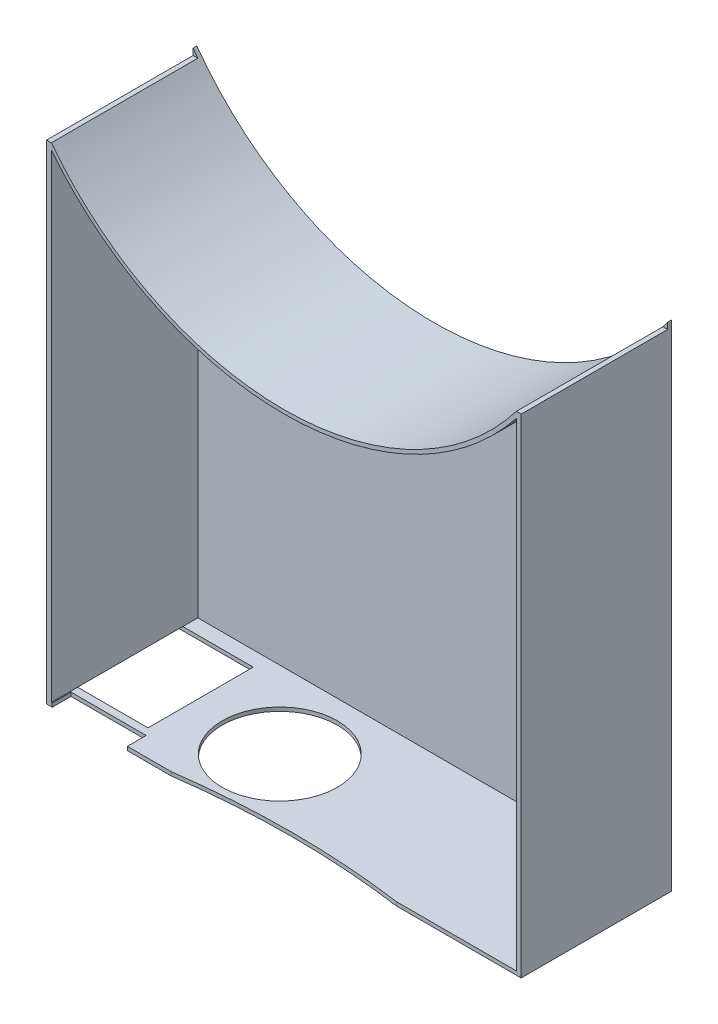
ISO-10303-21;
HEADER;
FILE_DESCRIPTION(('STEP AP214'),'2;1');
FILE_NAME('part.step','',(''),(''),'','','');
FILE_SCHEMA(('AUTOMOTIVE_DESIGN { 1 0 10303 214 1 1 1 1 }'));
ENDSEC;
DATA;
#1=APPLICATION_CONTEXT('core data for automotive mechanical design processes');
#2=APPLICATION_PROTOCOL_DEFINITION('international standard','automotive_design',2000,#1);
#3=PRODUCT_CONTEXT('',#1,'mechanical');
#4=PRODUCT('Part','Part','',(#3));
#5=PRODUCT_RELATED_PRODUCT_CATEGORY('part','',(#4));
#6=PRODUCT_DEFINITION_FORMATION('','',#4);
#7=PRODUCT_DEFINITION_CONTEXT('part definition',#1,'design');
#8=PRODUCT_DEFINITION('design','',#6,#7);
#9=PRODUCT_DEFINITION_SHAPE('','',#8);
#10=(LENGTH_UNIT() NAMED_UNIT(*) SI_UNIT(.MILLI.,.METRE.));
#11=(NAMED_UNIT(*) PLANE_ANGLE_UNIT() SI_UNIT($,.RADIAN.));
#12=(NAMED_UNIT(*) SI_UNIT($,.STERADIAN.) SOLID_ANGLE_UNIT());
#13=UNCERTAINTY_MEASURE_WITH_UNIT(LENGTH_MEASURE(1.E-05),#10,'distance_accuracy_value','');
#14=(GEOMETRIC_REPRESENTATION_CONTEXT(3) GLOBAL_UNCERTAINTY_ASSIGNED_CONTEXT((#13)) GLOBAL_UNIT_ASSIGNED_CONTEXT((#10,
#11,#12)) REPRESENTATION_CONTEXT('',''));
#15=CARTESIAN_POINT('',(0.,0.,0.));
#16=DIRECTION('',(0.,0.,1.));
#17=DIRECTION('',(1.,0.,0.));
#18=AXIS2_PLACEMENT_3D('',#15,#16,#17);
#19=CARTESIAN_POINT('',(0.,2.84494650060196E-13,0.));
#20=DIRECTION('',(0.,0.,1.));
#21=DIRECTION('',(1.,0.,0.));
#22=AXIS2_PLACEMENT_3D('',#19,#20,#21);
#23=PLANE('',#22);
#24=DIRECTION('',(1.,0.,0.));
#25=VECTOR('',#24,1.);
#26=CARTESIAN_POINT('',(-63.1581672483325,-177.455725785533,0.));
#27=LINE('',#26,#25);
#28=CARTESIAN_POINT('',(-63.1581672483325,-177.455725785533,0.));
#29=VERTEX_POINT('',#28);
#30=CARTESIAN_POINT('',(-61.6581672483325,-177.455725785533,0.));
#31=VERTEX_POINT('',#30);
#32=EDGE_CURVE('E365',#29,#31,#27,.T.);
#33=ORIENTED_EDGE('',*,*,#32,.T.);
#34=DIRECTION('',(0.,1.,0.));
#35=VECTOR('',#34,1.);
#36=CARTESIAN_POINT('',(-61.6581672483325,-177.455737785533,0.));
#37=LINE('',#36,#35);
#38=CARTESIAN_POINT('',(-61.6581672483325,-176.455725785533,0.));
#39=VERTEX_POINT('',#38);
#40=EDGE_CURVE('E241',#31,#39,#37,.T.);
#41=ORIENTED_EDGE('',*,*,#40,.T.);
#42=DIRECTION('',(-1.,0.,0.));
#43=VECTOR('',#42,1.);
#44=CARTESIAN_POINT('',(-63.1581672483325,-176.455725785533,0.));
#45=LINE('',#44,#43);
#46=CARTESIAN_POINT('',(-61.9027793412246,-176.455725785533,0.));
#47=VERTEX_POINT('',#46);
#48=EDGE_CURVE('E227',#39,#47,#45,.T.);
#49=ORIENTED_EDGE('',*,*,#48,.T.);
#50=DIRECTION('',(0.,1.,0.));
#51=VECTOR('',#50,1.);
#52=CARTESIAN_POINT('',(-61.9027793412246,-177.455725785533,0.));
#53=LINE('',#52,#51);
#54=CARTESIAN_POINT('',(-61.9027793412246,-49.0820324541645,0.));
#55=VERTEX_POINT('',#54);
#56=EDGE_CURVE('E380',#47,#55,#53,.T.);
#57=ORIENTED_EDGE('',*,*,#56,.T.);
#58=CARTESIAN_POINT('',(0.,1.11022302462516E-13,0.));
#59=DIRECTION('',(0.,0.,1.));
#60=DIRECTION('',(1.,0.,0.));
#61=AXIS2_PLACEMENT_3D('',#58,#59,#60);
#62=CIRCLE('',#61,79.0000000000001);
#63=CARTESIAN_POINT('',(61.9027793412246,-49.0820324541645,0.));
#64=VERTEX_POINT('',#63);
#65=EDGE_CURVE('E412',#55,#64,#62,.T.);
#66=ORIENTED_EDGE('',*,*,#65,.T.);
#67=DIRECTION('',(0.,1.,0.));
#68=VECTOR('',#67,1.);
#69=CARTESIAN_POINT('',(61.9027793412246,-177.455725785533,0.));
#70=LINE('',#69,#68);
#71=CARTESIAN_POINT('',(61.9027793412246,-176.455725785533,0.));
#72=VERTEX_POINT('',#71);
#73=EDGE_CURVE('E385',#72,#64,#70,.T.);
#74=ORIENTED_EDGE('',*,*,#73,.F.);
#75=CARTESIAN_POINT('',(30.,-176.455725785533,0.));
#76=VERTEX_POINT('',#75);
#77=EDGE_CURVE('E304',#72,#76,#45,.T.);
#78=ORIENTED_EDGE('',*,*,#77,.T.);
#79=DIRECTION('',(0.,-1.,0.));
#80=VECTOR('',#79,1.);
#81=CARTESIAN_POINT('',(30.,-138.455725785533,0.));
#82=LINE('',#81,#80);
#83=CARTESIAN_POINT('',(30.,-177.455725785533,0.));
#84=VERTEX_POINT('',#83);
#85=EDGE_CURVE('E297',#76,#84,#82,.T.);
#86=ORIENTED_EDGE('',*,*,#85,.T.);
#87=CARTESIAN_POINT('',(63.1581672483325,-177.455725785533,0.));
#88=VERTEX_POINT('',#87);
#89=EDGE_CURVE('E363',#84,#88,#27,.T.);
#90=ORIENTED_EDGE('',*,*,#89,.T.);
#91=DIRECTION('',(0.,1.,0.));
#92=VECTOR('',#91,1.);
#93=CARTESIAN_POINT('',(63.1581672483325,-177.455725785533,0.));
#94=LINE('',#93,#92);
#95=CARTESIAN_POINT('',(63.1581672483325,-47.4557257855326,0.));
#96=VERTEX_POINT('',#95);
#97=EDGE_CURVE('E389',#88,#96,#94,.T.);
#98=ORIENTED_EDGE('',*,*,#97,.T.);
#99=DIRECTION('',(-1.,0.,0.));
#100=VECTOR('',#99,1.);
#101=CARTESIAN_POINT('',(61.9027793412246,-47.4557257855326,0.));
#102=LINE('',#101,#100);
#103=CARTESIAN_POINT('',(61.9027793412246,-47.4557257855326,0.));
#104=VERTEX_POINT('',#103);
#105=EDGE_CURVE('E416',#96,#104,#102,.T.);
#106=ORIENTED_EDGE('',*,*,#105,.T.);
#107=CARTESIAN_POINT('',(0.,2.84494650060196E-13,0.));
#108=DIRECTION('',(0.,0.,-1.));
#109=DIRECTION('',(1.,0.,0.));
#110=AXIS2_PLACEMENT_3D('',#107,#108,#109);
#111=CIRCLE('',#110,78.0000000000002);
#112=CARTESIAN_POINT('',(-61.9027793412246,-47.4557257855326,0.));
#113=VERTEX_POINT('',#112);
#114=EDGE_CURVE('E404',#104,#113,#111,.T.);
#115=ORIENTED_EDGE('',*,*,#114,.T.);
#116=DIRECTION('',(-1.,0.,0.));
#117=VECTOR('',#116,1.);
#118=CARTESIAN_POINT('',(-63.1581672483325,-47.4557257855326,0.));
#119=LINE('',#118,#117);
#120=CARTESIAN_POINT('',(-63.1581672483325,-47.4557257855326,0.));
#121=VERTEX_POINT('',#120);
#122=EDGE_CURVE('E408',#113,#121,#119,.T.);
#123=ORIENTED_EDGE('',*,*,#122,.T.);
#124=DIRECTION('',(0.,1.,0.));
#125=VECTOR('',#124,1.);
#126=CARTESIAN_POINT('',(-63.1581672483325,-177.455725785533,0.));
#127=LINE('',#126,#125);
#128=EDGE_CURVE('E374',#29,#121,#127,.T.);
#129=ORIENTED_EDGE('',*,*,#128,.F.);
#130=EDGE_LOOP('',(#33,#41,#49,#57,#66,#74,#78,#86,#90,#98,#106,#115,#123,#129));
#131=FACE_BOUND('',#130,.T.);
#132=ADVANCED_FACE('F47',(#131),#23,.T.);
#133=CARTESIAN_POINT('',(-30.,-176.455725785533,0.));
#134=VERTEX_POINT('',#133);
#135=CARTESIAN_POINT('',(-41.6581672483325,-176.455725785533,0.));
#136=VERTEX_POINT('',#135);
#137=EDGE_CURVE('E309',#134,#136,#45,.T.);
#138=ORIENTED_EDGE('',*,*,#137,.T.);
#139=DIRECTION('',(0.,1.,0.));
#140=VECTOR('',#139,1.);
#141=CARTESIAN_POINT('',(-41.6581672483325,-177.455737785533,0.));
#142=LINE('',#141,#140);
#143=CARTESIAN_POINT('',(-41.6581672483325,-177.455725785533,0.));
#144=VERTEX_POINT('',#143);
#145=EDGE_CURVE('E244',#144,#136,#142,.T.);
#146=ORIENTED_EDGE('',*,*,#145,.F.);
#147=CARTESIAN_POINT('',(-30.,-177.455725785533,0.));
#148=VERTEX_POINT('',#147);
#149=EDGE_CURVE('E370',#144,#148,#27,.T.);
#150=ORIENTED_EDGE('',*,*,#149,.T.);
#151=DIRECTION('',(0.,-1.,0.));
#152=VECTOR('',#151,1.);
#153=CARTESIAN_POINT('',(-30.,-138.455725785533,0.));
#154=LINE('',#153,#152);
#155=EDGE_CURVE('E296',#134,#148,#154,.T.);
#156=ORIENTED_EDGE('',*,*,#155,.F.);
#157=EDGE_LOOP('',(#138,#146,#150,#156));
#158=FACE_BOUND('',#157,.T.);
#159=ADVANCED_FACE('F486',(#158),#23,.T.);
#160=CARTESIAN_POINT('',(-63.1581672483325,-177.455725785533,0.));
#161=DIRECTION('',(-1.,0.,0.));
#162=DIRECTION('',(0.,0.,1.));
#163=AXIS2_PLACEMENT_3D('',#160,#161,#162);
#164=PLANE('',#163);
#165=DIRECTION('',(0.,0.,1.));
#166=VECTOR('',#165,1.);
#167=CARTESIAN_POINT('',(-63.1581672483325,-177.455725785533,0.));
#168=LINE('',#167,#166);
#169=CARTESIAN_POINT('',(-63.1581672483325,-177.455725785533,-40.));
#170=VERTEX_POINT('',#169);
#171=CARTESIAN_POINT('',(-63.1581672483325,-177.455725785533,-35.));
#172=VERTEX_POINT('',#171);
#173=EDGE_CURVE('E359',#170,#172,#168,.T.);
#174=ORIENTED_EDGE('',*,*,#173,.T.);
#175=DIRECTION('',(0.,1.,0.));
#176=VECTOR('',#175,1.);
#177=CARTESIAN_POINT('',(-63.1581672483325,-177.455737785533,-35.));
#178=LINE('',#177,#176);
#179=CARTESIAN_POINT('',(-63.1581672483325,-176.455725785533,-35.));
#180=VERTEX_POINT('',#179);
#181=EDGE_CURVE('E249',#172,#180,#178,.T.);
#182=ORIENTED_EDGE('',*,*,#181,.T.);
#183=DIRECTION('',(0.,0.,-1.));
#184=VECTOR('',#183,1.);
#185=CARTESIAN_POINT('',(-63.1581672483325,-176.455725785533,-7.));
#186=LINE('',#185,#184);
#187=CARTESIAN_POINT('',(-63.1581672483325,-176.455725785533,-7.));
#188=VERTEX_POINT('',#187);
#189=EDGE_CURVE('E229',#188,#180,#186,.T.);
#190=ORIENTED_EDGE('',*,*,#189,.F.);
#191=DIRECTION('',(0.,1.,0.));
#192=VECTOR('',#191,1.);
#193=CARTESIAN_POINT('',(-63.1581672483325,-177.455737785533,-7.));
#194=LINE('',#193,#192);
#195=CARTESIAN_POINT('',(-63.1581672483325,-177.455725785533,-7.));
#196=VERTEX_POINT('',#195);
#197=EDGE_CURVE('E259',#196,#188,#194,.T.);
#198=ORIENTED_EDGE('',*,*,#197,.F.);
#199=EDGE_CURVE('E364',#196,#29,#168,.T.);
#200=ORIENTED_EDGE('',*,*,#199,.T.);
#201=ORIENTED_EDGE('',*,*,#128,.T.);
#202=DIRECTION('',(0.,0.,1.));
#203=VECTOR('',#202,1.);
#204=CARTESIAN_POINT('',(-63.1581672483325,-47.4557257855326,-40.));
#205=LINE('',#204,#203);
#206=CARTESIAN_POINT('',(-63.1581672483325,-47.4557257855326,-39.));
#207=VERTEX_POINT('',#206);
#208=EDGE_CURVE('E429',#207,#121,#205,.T.);
#209=ORIENTED_EDGE('',*,*,#208,.F.);
#210=DIRECTION('',(0.,-1.,0.));
#211=VECTOR('',#210,1.);
#212=CARTESIAN_POINT('',(-63.1581672483325,-27.4557257855326,-39.));
#213=LINE('',#212,#211);
#214=CARTESIAN_POINT('',(-63.1581672483325,-45.7716714773632,-39.));
#215=VERTEX_POINT('',#214);
#216=EDGE_CURVE('E334',#215,#207,#213,.T.);
#217=ORIENTED_EDGE('',*,*,#216,.F.);
#218=DIRECTION('',(0.,0.,1.));
#219=VECTOR('',#218,1.);
#220=CARTESIAN_POINT('',(-63.1581672483325,-45.7716714773632,-129.));
#221=LINE('',#220,#219);
#222=CARTESIAN_POINT('',(-63.1581672483325,-45.7716714773632,-40.));
#223=VERTEX_POINT('',#222);
#224=EDGE_CURVE('E330',#223,#215,#221,.T.);
#225=ORIENTED_EDGE('',*,*,#224,.F.);
#226=DIRECTION('',(0.,1.,0.));
#227=VECTOR('',#226,1.);
#228=CARTESIAN_POINT('',(-63.1581672483325,-177.455725785533,-40.));
#229=LINE('',#228,#227);
#230=EDGE_CURVE('E375',#170,#223,#229,.T.);
#231=ORIENTED_EDGE('',*,*,#230,.F.);
#232=EDGE_LOOP('',(#174,#182,#190,#198,#200,#201,#209,#217,#225,#231));
#233=FACE_BOUND('',#232,.T.);
#234=ADVANCED_FACE('F492',(#233),#164,.T.);
#235=CARTESIAN_POINT('',(0.,-177.455725785533,0.));
#236=DIRECTION('',(0.,-1.,0.));
#237=DIRECTION('',(0.,0.,-1.));
#238=AXIS2_PLACEMENT_3D('',#235,#236,#237);
#239=PLANE('',#238);
#240=CARTESIAN_POINT('',(-19.5876766170702,-177.455725785533,-18.4993312269172));
#241=DIRECTION('',(0.,-1.,0.));
#242=DIRECTION('',(0.,0.,-1.));
#243=AXIS2_PLACEMENT_3D('',#240,#241,#242);
#244=CIRCLE('',#243,15.3356405172815);
#245=CARTESIAN_POINT('',(-19.5876766170702,-177.455725785533,-33.8349717441988));
#246=VERTEX_POINT('',#245);
#247=EDGE_CURVE('E236',#246,#246,#244,.T.);
#248=ORIENTED_EDGE('',*,*,#247,.F.);
#249=EDGE_LOOP('',(#248));
#250=FACE_BOUND('',#249,.T.);
#251=DIRECTION('',(-1.,0.,0.));
#252=VECTOR('',#251,1.);
#253=CARTESIAN_POINT('',(0.,-177.455725785533,-5.));
#254=LINE('',#253,#252);
#255=CARTESIAN_POINT('',(-41.6581672483325,-177.455725785533,-5.));
#256=VERTEX_POINT('',#255);
#257=CARTESIAN_POINT('',(-61.6581672483325,-177.455725785533,-5.));
#258=VERTEX_POINT('',#257);
#259=EDGE_CURVE('E288',#256,#258,#254,.T.);
#260=ORIENTED_EDGE('',*,*,#259,.T.);
#261=DIRECTION('',(0.,0.,1.));
#262=VECTOR('',#261,1.);
#263=CARTESIAN_POINT('',(-61.6581672483325,-177.455725785533,1.71135792338219E-13));
#264=LINE('',#263,#262);
#265=EDGE_CURVE('E207',#258,#31,#264,.T.);
#266=ORIENTED_EDGE('',*,*,#265,.T.);
#267=ORIENTED_EDGE('',*,*,#32,.F.);
#268=ORIENTED_EDGE('',*,*,#199,.F.);
#269=DIRECTION('',(1.,0.,0.));
#270=VECTOR('',#269,1.);
#271=CARTESIAN_POINT('',(0.,-177.455725785533,-7.));
#272=LINE('',#271,#270);
#273=CARTESIAN_POINT('',(-43.1581672483325,-177.455725785533,-7.));
#274=VERTEX_POINT('',#273);
#275=EDGE_CURVE('E211',#196,#274,#272,.T.);
#276=ORIENTED_EDGE('',*,*,#275,.T.);
#277=DIRECTION('',(0.,0.,-1.));
#278=VECTOR('',#277,1.);
#279=CARTESIAN_POINT('',(-43.1581672483325,-177.455725785533,0.));
#280=LINE('',#279,#278);
#281=CARTESIAN_POINT('',(-43.1581672483325,-177.455725785533,-35.));
#282=VERTEX_POINT('',#281);
#283=EDGE_CURVE('E276',#274,#282,#280,.T.);
#284=ORIENTED_EDGE('',*,*,#283,.T.);
#285=DIRECTION('',(-1.,0.,0.));
#286=VECTOR('',#285,1.);
#287=CARTESIAN_POINT('',(0.,-177.455725785533,-35.));
#288=LINE('',#287,#286);
#289=EDGE_CURVE('E280',#282,#172,#288,.T.);
#290=ORIENTED_EDGE('',*,*,#289,.T.);
#291=ORIENTED_EDGE('',*,*,#173,.F.);
#292=DIRECTION('',(-1.,0.,0.));
#293=VECTOR('',#292,1.);
#294=CARTESIAN_POINT('',(-63.1581672483325,-177.455725785533,-40.));
#295=LINE('',#294,#293);
#296=CARTESIAN_POINT('',(63.1581672483325,-177.455725785533,-40.));
#297=VERTEX_POINT('',#296);
#298=EDGE_CURVE('E369',#297,#170,#295,.T.);
#299=ORIENTED_EDGE('',*,*,#298,.F.);
#300=DIRECTION('',(0.,0.,-1.));
#301=VECTOR('',#300,1.);
#302=CARTESIAN_POINT('',(63.1581672483325,-177.455725785533,-40.));
#303=LINE('',#302,#301);
#304=EDGE_CURVE('E388',#88,#297,#303,.T.);
#305=ORIENTED_EDGE('',*,*,#304,.F.);
#306=ORIENTED_EDGE('',*,*,#89,.F.);
#307=CARTESIAN_POINT('',(0.,-177.455725785533,215.767352745814));
#308=DIRECTION('',(0.,-1.,0.));
#309=DIRECTION('',(0.,0.,-1.));
#310=AXIS2_PLACEMENT_3D('',#307,#308,#309);
#311=CIRCLE('',#310,217.842949188025);
#312=EDGE_CURVE('E293',#148,#84,#311,.T.);
#313=ORIENTED_EDGE('',*,*,#312,.F.);
#314=ORIENTED_EDGE('',*,*,#149,.F.);
#315=DIRECTION('',(0.,0.,-1.));
#316=VECTOR('',#315,1.);
#317=CARTESIAN_POINT('',(-41.6581672483325,-177.455725785533,0.));
#318=LINE('',#317,#316);
#319=EDGE_CURVE('E284',#144,#256,#318,.T.);
#320=ORIENTED_EDGE('',*,*,#319,.T.);
#321=EDGE_LOOP('',(#260,#266,#267,#268,#276,#284,#290,#291,#299,#305,#306,#313,#314,#320));
#322=FACE_BOUND('',#321,.T.);
#323=ADVANCED_FACE('F524',(#250,#322),#239,.T.);
#324=CARTESIAN_POINT('',(-63.1581672483325,-176.455725785533,0.));
#325=DIRECTION('',(0.,-1.,0.));
#326=DIRECTION('',(0.,0.,-1.));
#327=AXIS2_PLACEMENT_3D('',#324,#325,#326);
#328=PLANE('',#327);
#329=CARTESIAN_POINT('',(-19.5876766170702,-176.455725785533,-18.4993312269172));
#330=DIRECTION('',(0.,-1.,0.));
#331=DIRECTION('',(0.,0.,-1.));
#332=AXIS2_PLACEMENT_3D('',#329,#330,#331);
#333=CIRCLE('',#332,15.3356405172815);
#334=CARTESIAN_POINT('',(-19.5876766170702,-176.455725785533,-33.8349717441988));
#335=VERTEX_POINT('',#334);
#336=EDGE_CURVE('E254',#335,#335,#333,.T.);
#337=ORIENTED_EDGE('',*,*,#336,.T.);
#338=EDGE_LOOP('',(#337));
#339=FACE_BOUND('',#338,.T.);
#340=DIRECTION('',(0.,0.,-1.));
#341=VECTOR('',#340,1.);
#342=CARTESIAN_POINT('',(-61.6581672483325,-176.455725785533,0.));
#343=LINE('',#342,#341);
#344=CARTESIAN_POINT('',(-61.6581672483325,-176.455725785533,-5.));
#345=VERTEX_POINT('',#344);
#346=EDGE_CURVE('E204',#39,#345,#343,.T.);
#347=ORIENTED_EDGE('',*,*,#346,.T.);
#348=DIRECTION('',(1.,0.,0.));
#349=VECTOR('',#348,1.);
#350=CARTESIAN_POINT('',(-61.6581672483325,-176.455725785533,-5.));
#351=LINE('',#350,#349);
#352=CARTESIAN_POINT('',(-41.6581672483325,-176.455725785533,-5.));
#353=VERTEX_POINT('',#352);
#354=EDGE_CURVE('E215',#345,#353,#351,.T.);
#355=ORIENTED_EDGE('',*,*,#354,.T.);
#356=DIRECTION('',(0.,0.,1.));
#357=VECTOR('',#356,1.);
#358=CARTESIAN_POINT('',(-41.6581672483325,-176.455725785533,0.));
#359=LINE('',#358,#357);
#360=EDGE_CURVE('E222',#353,#136,#359,.T.);
#361=ORIENTED_EDGE('',*,*,#360,.T.);
#362=ORIENTED_EDGE('',*,*,#137,.F.);
#363=CARTESIAN_POINT('',(0.,-176.455725785533,215.767352745814));
#364=DIRECTION('',(0.,-1.,0.));
#365=DIRECTION('',(0.,0.,-1.));
#366=AXIS2_PLACEMENT_3D('',#363,#364,#365);
#367=CIRCLE('',#366,217.842949188025);
#368=EDGE_CURVE('E56',#134,#76,#367,.T.);
#369=ORIENTED_EDGE('',*,*,#368,.T.);
#370=ORIENTED_EDGE('',*,*,#77,.F.);
#371=DIRECTION('',(0.,0.,1.));
#372=VECTOR('',#371,1.);
#373=CARTESIAN_POINT('',(61.9027793412246,-176.455725785533,-40.));
#374=LINE('',#373,#372);
#375=CARTESIAN_POINT('',(61.9027793412246,-176.455725785533,-39.));
#376=VERTEX_POINT('',#375);
#377=EDGE_CURVE('E308',#376,#72,#374,.T.);
#378=ORIENTED_EDGE('',*,*,#377,.F.);
#379=DIRECTION('',(1.,0.,0.));
#380=VECTOR('',#379,1.);
#381=CARTESIAN_POINT('',(-63.1581672483325,-176.455725785533,-39.));
#382=LINE('',#381,#380);
#383=CARTESIAN_POINT('',(-61.9027793412246,-176.455725785533,-39.));
#384=VERTEX_POINT('',#383);
#385=EDGE_CURVE('E424',#384,#376,#382,.T.);
#386=ORIENTED_EDGE('',*,*,#385,.F.);
#387=DIRECTION('',(0.,0.,-1.));
#388=VECTOR('',#387,1.);
#389=CARTESIAN_POINT('',(-61.9027793412246,-176.455725785533,0.));
#390=LINE('',#389,#388);
#391=CARTESIAN_POINT('',(-61.9027793412246,-176.455725785533,-35.));
#392=VERTEX_POINT('',#391);
#393=EDGE_CURVE('E313',#392,#384,#390,.T.);
#394=ORIENTED_EDGE('',*,*,#393,.F.);
#395=DIRECTION('',(-1.,0.,0.));
#396=VECTOR('',#395,1.);
#397=CARTESIAN_POINT('',(-63.1581672483325,-176.455725785533,-35.));
#398=LINE('',#397,#396);
#399=CARTESIAN_POINT('',(-43.1581672483325,-176.455725785533,-35.));
#400=VERTEX_POINT('',#399);
#401=EDGE_CURVE('E11',#400,#392,#398,.T.);
#402=ORIENTED_EDGE('',*,*,#401,.F.);
#403=DIRECTION('',(0.,0.,1.));
#404=VECTOR('',#403,1.);
#405=CARTESIAN_POINT('',(-43.1581672483325,-176.455725785533,-7.));
#406=LINE('',#405,#404);
#407=CARTESIAN_POINT('',(-43.1581672483325,-176.455725785533,-7.));
#408=VERTEX_POINT('',#407);
#409=EDGE_CURVE('E266',#400,#408,#406,.T.);
#410=ORIENTED_EDGE('',*,*,#409,.T.);
#411=DIRECTION('',(-1.,0.,0.));
#412=VECTOR('',#411,1.);
#413=CARTESIAN_POINT('',(-63.1581672483325,-176.455725785533,-7.));
#414=LINE('',#413,#412);
#415=CARTESIAN_POINT('',(-61.9027793412246,-176.455725785533,-7.));
#416=VERTEX_POINT('',#415);
#417=EDGE_CURVE('E262',#408,#416,#414,.T.);
#418=ORIENTED_EDGE('',*,*,#417,.T.);
#419=EDGE_CURVE('E314',#47,#416,#390,.T.);
#420=ORIENTED_EDGE('',*,*,#419,.F.);
#421=ORIENTED_EDGE('',*,*,#48,.F.);
#422=EDGE_LOOP('',(#347,#355,#361,#362,#369,#370,#378,#386,#394,#402,#410,#418,#420,#421));
#423=FACE_BOUND('',#422,.T.);
#424=ADVANCED_FACE('F225',(#339,#423),#328,.F.);
#425=CARTESIAN_POINT('',(-61.9027793412246,-177.455725785533,0.));
#426=DIRECTION('',(1.,0.,0.));
#427=DIRECTION('',(0.,0.,-1.));
#428=AXIS2_PLACEMENT_3D('',#425,#426,#427);
#429=PLANE('',#428);
#430=ORIENTED_EDGE('',*,*,#56,.F.);
#431=ORIENTED_EDGE('',*,*,#419,.T.);
#432=EDGE_CURVE('E319',#416,#392,#390,.T.);
#433=ORIENTED_EDGE('',*,*,#432,.T.);
#434=ORIENTED_EDGE('',*,*,#393,.T.);
#435=DIRECTION('',(0.,-1.,0.));
#436=VECTOR('',#435,1.);
#437=CARTESIAN_POINT('',(-61.9027793412246,-177.455725785533,-39.));
#438=LINE('',#437,#436);
#439=CARTESIAN_POINT('',(-61.9027793412246,-49.0820324541645,-39.));
#440=VERTEX_POINT('',#439);
#441=EDGE_CURVE('E346',#440,#384,#438,.T.);
#442=ORIENTED_EDGE('',*,*,#441,.F.);
#443=DIRECTION('',(0.,0.,1.));
#444=VECTOR('',#443,1.);
#445=CARTESIAN_POINT('',(-61.9027793412246,-49.0820324541645,-40.));
#446=LINE('',#445,#444);
#447=EDGE_CURVE('E400',#440,#55,#446,.T.);
#448=ORIENTED_EDGE('',*,*,#447,.T.);
#449=EDGE_LOOP('',(#430,#431,#433,#434,#442,#448));
#450=FACE_BOUND('',#449,.T.);
#451=ADVANCED_FACE('F464',(#450),#429,.T.);
#452=CARTESIAN_POINT('',(61.9027793412246,-177.455725785533,-40.));
#453=DIRECTION('',(-1.,0.,0.));
#454=DIRECTION('',(0.,0.,1.));
#455=AXIS2_PLACEMENT_3D('',#452,#453,#454);
#456=PLANE('',#455);
#457=DIRECTION('',(0.,1.,0.));
#458=VECTOR('',#457,1.);
#459=CARTESIAN_POINT('',(61.9027793412246,-177.455725785533,-39.));
#460=LINE('',#459,#458);
#461=CARTESIAN_POINT('',(61.9027793412246,-49.0820324541645,-39.));
#462=VERTEX_POINT('',#461);
#463=EDGE_CURVE('E337',#376,#462,#460,.T.);
#464=ORIENTED_EDGE('',*,*,#463,.F.);
#465=ORIENTED_EDGE('',*,*,#377,.T.);
#466=ORIENTED_EDGE('',*,*,#73,.T.);
#467=DIRECTION('',(0.,0.,1.));
#468=VECTOR('',#467,1.);
#469=CARTESIAN_POINT('',(61.9027793412246,-49.0820324541645,-40.));
#470=LINE('',#469,#468);
#471=EDGE_CURVE('E379',#64,#462,#470,.F.);
#472=ORIENTED_EDGE('',*,*,#471,.T.);
#473=EDGE_LOOP('',(#464,#465,#466,#472));
#474=FACE_BOUND('',#473,.T.);
#475=ADVANCED_FACE('F450',(#474),#456,.T.);
#476=CARTESIAN_POINT('',(-63.1581672483325,-27.4557257855326,-39.));
#477=DIRECTION('',(0.,0.,1.));
#478=DIRECTION('',(1.,0.,0.));
#479=AXIS2_PLACEMENT_3D('',#476,#477,#478);
#480=PLANE('',#479);
#481=ORIENTED_EDGE('',*,*,#441,.T.);
#482=ORIENTED_EDGE('',*,*,#385,.T.);
#483=ORIENTED_EDGE('',*,*,#463,.T.);
#484=CARTESIAN_POINT('',(0.,1.11022302462516E-13,-39.));
#485=DIRECTION('',(0.,0.,1.));
#486=DIRECTION('',(1.,0.,0.));
#487=AXIS2_PLACEMENT_3D('',#484,#485,#486);
#488=CIRCLE('',#487,79.0000000000001);
#489=EDGE_CURVE('E342',#462,#440,#488,.F.);
#490=ORIENTED_EDGE('',*,*,#489,.T.);
#491=EDGE_LOOP('',(#481,#482,#483,#490));
#492=FACE_BOUND('',#491,.T.);
#493=ADVANCED_FACE('F456',(#492),#480,.T.);
#494=CARTESIAN_POINT('',(0.,0.,-39.));
#495=DIRECTION('',(0.,0.,1.));
#496=DIRECTION('',(1.,0.,0.));
#497=AXIS2_PLACEMENT_3D('',#494,#495,#496);
#498=CIRCLE('',#497,78.);
#499=CARTESIAN_POINT('',(-61.9027793412246,-47.4557257855326,-39.));
#500=VERTEX_POINT('',#499);
#501=EDGE_CURVE('E320',#215,#500,#498,.T.);
#502=ORIENTED_EDGE('',*,*,#501,.F.);
#503=ORIENTED_EDGE('',*,*,#216,.T.);
#504=DIRECTION('',(1.,0.,0.));
#505=VECTOR('',#504,1.);
#506=CARTESIAN_POINT('',(-63.1581672483325,-47.4557257855326,-39.));
#507=LINE('',#506,#505);
#508=EDGE_CURVE('E350',#207,#500,#507,.T.);
#509=ORIENTED_EDGE('',*,*,#508,.T.);
#510=EDGE_LOOP('',(#502,#503,#509));
#511=FACE_BOUND('',#510,.T.);
#512=ADVANCED_FACE('F549',(#511),#480,.T.);
#513=CARTESIAN_POINT('',(0.,2.84494650060196E-13,-40.));
#514=DIRECTION('',(0.,0.,1.));
#515=DIRECTION('',(1.,0.,0.));
#516=AXIS2_PLACEMENT_3D('',#513,#514,#515);
#517=CYLINDRICAL_SURFACE('',#516,78.0000000000002);
#518=DIRECTION('',(0.,0.,1.));
#519=VECTOR('',#518,1.);
#520=CARTESIAN_POINT('',(61.9027793412246,-47.4557257855326,-40.));
#521=LINE('',#520,#519);
#522=CARTESIAN_POINT('',(61.9027793412246,-47.4557257855326,-39.));
#523=VERTEX_POINT('',#522);
#524=EDGE_CURVE('E421',#523,#104,#521,.T.);
#525=ORIENTED_EDGE('',*,*,#524,.F.);
#526=CARTESIAN_POINT('',(63.1581672483325,-45.7716714773632,-39.));
#527=VERTEX_POINT('',#526);
#528=EDGE_CURVE('E318',#523,#527,#498,.T.);
#529=ORIENTED_EDGE('',*,*,#528,.T.);
#530=DIRECTION('',(0.,0.,1.));
#531=VECTOR('',#530,1.);
#532=CARTESIAN_POINT('',(63.1581672483325,-45.7716714773632,-129.));
#533=LINE('',#532,#531);
#534=CARTESIAN_POINT('',(63.1581672483325,-45.7716714773632,-40.));
#535=VERTEX_POINT('',#534);
#536=EDGE_CURVE('E323',#527,#535,#533,.F.);
#537=ORIENTED_EDGE('',*,*,#536,.T.);
#538=CARTESIAN_POINT('',(0.,0.,-40.));
#539=DIRECTION('',(0.,0.,1.));
#540=DIRECTION('',(1.,0.,0.));
#541=AXIS2_PLACEMENT_3D('',#538,#539,#540);
#542=CIRCLE('',#541,78.);
#543=EDGE_CURVE('E326',#223,#535,#542,.T.);
#544=ORIENTED_EDGE('',*,*,#543,.F.);
#545=ORIENTED_EDGE('',*,*,#224,.T.);
#546=ORIENTED_EDGE('',*,*,#501,.T.);
#547=DIRECTION('',(0.,0.,1.));
#548=VECTOR('',#547,1.);
#549=CARTESIAN_POINT('',(-61.9027793412246,-47.4557257855326,-40.));
#550=LINE('',#549,#548);
#551=EDGE_CURVE('E420',#500,#113,#550,.T.);
#552=ORIENTED_EDGE('',*,*,#551,.T.);
#553=ORIENTED_EDGE('',*,*,#114,.F.);
#554=EDGE_LOOP('',(#525,#529,#537,#544,#545,#546,#552,#553));
#555=FACE_BOUND('',#554,.T.);
#556=ADVANCED_FACE('F49',(#555),#517,.F.);
#557=CARTESIAN_POINT('',(61.9027793412246,-47.4557257855326,-40.));
#558=DIRECTION('',(0.,1.,0.));
#559=DIRECTION('',(0.,0.,1.));
#560=AXIS2_PLACEMENT_3D('',#557,#558,#559);
#561=PLANE('',#560);
#562=DIRECTION('',(1.,0.,0.));
#563=VECTOR('',#562,1.);
#564=CARTESIAN_POINT('',(61.9027793412246,-47.4557257855326,-39.));
#565=LINE('',#564,#563);
#566=CARTESIAN_POINT('',(63.1581672483325,-47.4557257855326,-39.));
#567=VERTEX_POINT('',#566);
#568=EDGE_CURVE('E354',#523,#567,#565,.T.);
#569=ORIENTED_EDGE('',*,*,#568,.F.);
#570=ORIENTED_EDGE('',*,*,#524,.T.);
#571=ORIENTED_EDGE('',*,*,#105,.F.);
#572=DIRECTION('',(0.,0.,1.));
#573=VECTOR('',#572,1.);
#574=CARTESIAN_POINT('',(63.1581672483325,-47.4557257855326,-40.));
#575=LINE('',#574,#573);
#576=EDGE_CURVE('E425',#567,#96,#575,.T.);
#577=ORIENTED_EDGE('',*,*,#576,.F.);
#578=EDGE_LOOP('',(#569,#570,#571,#577));
#579=FACE_BOUND('',#578,.T.);
#580=ADVANCED_FACE('F498',(#579),#561,.T.);
#581=CARTESIAN_POINT('',(0.,1.11022302462516E-13,-40.));
#582=DIRECTION('',(0.,0.,1.));
#583=DIRECTION('',(1.,0.,0.));
#584=AXIS2_PLACEMENT_3D('',#581,#582,#583);
#585=CYLINDRICAL_SURFACE('',#584,79.0000000000001);
#586=ORIENTED_EDGE('',*,*,#489,.F.);
#587=ORIENTED_EDGE('',*,*,#471,.F.);
#588=ORIENTED_EDGE('',*,*,#65,.F.);
#589=ORIENTED_EDGE('',*,*,#447,.F.);
#590=EDGE_LOOP('',(#586,#587,#588,#589));
#591=FACE_BOUND('',#590,.T.);
#592=ADVANCED_FACE('F453',(#591),#585,.T.);
#593=CARTESIAN_POINT('',(-63.1581672483325,-47.4557257855326,-40.));
#594=DIRECTION('',(0.,1.,0.));
#595=DIRECTION('',(0.,0.,1.));
#596=AXIS2_PLACEMENT_3D('',#593,#594,#595);
#597=PLANE('',#596);
#598=ORIENTED_EDGE('',*,*,#508,.F.);
#599=ORIENTED_EDGE('',*,*,#208,.T.);
#600=ORIENTED_EDGE('',*,*,#122,.F.);
#601=ORIENTED_EDGE('',*,*,#551,.F.);
#602=EDGE_LOOP('',(#598,#599,#600,#601));
#603=FACE_BOUND('',#602,.T.);
#604=ADVANCED_FACE('F503',(#603),#597,.T.);
#605=CARTESIAN_POINT('',(0.,2.84494650060196E-13,-40.));
#606=DIRECTION('',(0.,0.,1.));
#607=DIRECTION('',(1.,0.,0.));
#608=AXIS2_PLACEMENT_3D('',#605,#606,#607);
#609=PLANE('',#608);
#610=ORIENTED_EDGE('',*,*,#230,.T.);
#611=ORIENTED_EDGE('',*,*,#543,.T.);
#612=DIRECTION('',(0.,1.,0.));
#613=VECTOR('',#612,1.);
#614=CARTESIAN_POINT('',(63.1581672483325,-177.455725785533,-40.));
#615=LINE('',#614,#613);
#616=EDGE_CURVE('E358',#297,#535,#615,.T.);
#617=ORIENTED_EDGE('',*,*,#616,.F.);
#618=ORIENTED_EDGE('',*,*,#298,.T.);
#619=EDGE_LOOP('',(#610,#611,#617,#618));
#620=FACE_BOUND('',#619,.T.);
#621=ADVANCED_FACE('F496',(#620),#609,.F.);
#622=CARTESIAN_POINT('',(63.1581672483325,-177.455725785533,-40.));
#623=DIRECTION('',(1.,0.,0.));
#624=DIRECTION('',(0.,0.,-1.));
#625=AXIS2_PLACEMENT_3D('',#622,#623,#624);
#626=PLANE('',#625);
#627=ORIENTED_EDGE('',*,*,#576,.T.);
#628=ORIENTED_EDGE('',*,*,#97,.F.);
#629=ORIENTED_EDGE('',*,*,#304,.T.);
#630=ORIENTED_EDGE('',*,*,#616,.T.);
#631=ORIENTED_EDGE('',*,*,#536,.F.);
#632=DIRECTION('',(0.,-1.,0.));
#633=VECTOR('',#632,1.);
#634=CARTESIAN_POINT('',(63.1581672483325,-27.4557257855326,-39.));
#635=LINE('',#634,#633);
#636=EDGE_CURVE('E333',#527,#567,#635,.T.);
#637=ORIENTED_EDGE('',*,*,#636,.T.);
#638=EDGE_LOOP('',(#627,#628,#629,#630,#631,#637));
#639=FACE_BOUND('',#638,.T.);
#640=ADVANCED_FACE('F509',(#639),#626,.T.);
#641=ORIENTED_EDGE('',*,*,#528,.F.);
#642=ORIENTED_EDGE('',*,*,#568,.T.);
#643=ORIENTED_EDGE('',*,*,#636,.F.);
#644=EDGE_LOOP('',(#641,#642,#643));
#645=FACE_BOUND('',#644,.T.);
#646=ADVANCED_FACE('F547',(#645),#480,.T.);
#647=CARTESIAN_POINT('',(0.,-138.455725785533,215.767352745814));
#648=DIRECTION('',(0.,-1.,0.));
#649=DIRECTION('',(0.,0.,-1.));
#650=AXIS2_PLACEMENT_3D('',#647,#648,#649);
#651=CYLINDRICAL_SURFACE('',#650,217.842949188025);
#652=ORIENTED_EDGE('',*,*,#155,.T.);
#653=ORIENTED_EDGE('',*,*,#312,.T.);
#654=ORIENTED_EDGE('',*,*,#85,.F.);
#655=ORIENTED_EDGE('',*,*,#368,.F.);
#656=EDGE_LOOP('',(#652,#653,#654,#655));
#657=FACE_BOUND('',#656,.T.);
#658=ADVANCED_FACE('F530',(#657),#651,.F.);
#659=CARTESIAN_POINT('',(-63.1581672483325,-177.455737785533,-35.));
#660=DIRECTION('',(0.,0.,1.));
#661=DIRECTION('',(1.,0.,0.));
#662=AXIS2_PLACEMENT_3D('',#659,#660,#661);
#663=PLANE('',#662);
#664=DIRECTION('',(0.,1.,0.));
#665=VECTOR('',#664,1.);
#666=CARTESIAN_POINT('',(-43.1581672483325,-177.455737785533,-35.));
#667=LINE('',#666,#665);
#668=EDGE_CURVE('E253',#282,#400,#667,.T.);
#669=ORIENTED_EDGE('',*,*,#668,.T.);
#670=ORIENTED_EDGE('',*,*,#401,.T.);
#671=DIRECTION('',(1.,0.,0.));
#672=VECTOR('',#671,1.);
#673=CARTESIAN_POINT('',(-63.1581672483325,-176.455725785533,-35.));
#674=LINE('',#673,#672);
#675=EDGE_CURVE('E233',#180,#392,#674,.T.);
#676=ORIENTED_EDGE('',*,*,#675,.F.);
#677=ORIENTED_EDGE('',*,*,#181,.F.);
#678=ORIENTED_EDGE('',*,*,#289,.F.);
#679=EDGE_LOOP('',(#669,#670,#676,#677,#678));
#680=FACE_BOUND('',#679,.T.);
#681=ADVANCED_FACE('F482',(#680),#663,.T.);
#682=CARTESIAN_POINT('',(-43.1581672483325,-177.455737785533,-7.));
#683=DIRECTION('',(-1.,0.,0.));
#684=DIRECTION('',(0.,0.,1.));
#685=AXIS2_PLACEMENT_3D('',#682,#683,#684);
#686=PLANE('',#685);
#687=DIRECTION('',(0.,1.,0.));
#688=VECTOR('',#687,1.);
#689=CARTESIAN_POINT('',(-43.1581672483325,-177.455737785533,-7.));
#690=LINE('',#689,#688);
#691=EDGE_CURVE('E63',#274,#408,#690,.T.);
#692=ORIENTED_EDGE('',*,*,#691,.T.);
#693=ORIENTED_EDGE('',*,*,#409,.F.);
#694=ORIENTED_EDGE('',*,*,#668,.F.);
#695=ORIENTED_EDGE('',*,*,#283,.F.);
#696=EDGE_LOOP('',(#692,#693,#694,#695));
#697=FACE_BOUND('',#696,.T.);
#698=ADVANCED_FACE('F475',(#697),#686,.T.);
#699=CARTESIAN_POINT('',(-63.1581672483325,-177.455737785533,-7.));
#700=DIRECTION('',(0.,0.,-1.));
#701=DIRECTION('',(-1.,0.,0.));
#702=AXIS2_PLACEMENT_3D('',#699,#700,#701);
#703=PLANE('',#702);
#704=ORIENTED_EDGE('',*,*,#197,.T.);
#705=EDGE_CURVE('E69',#416,#188,#414,.T.);
#706=ORIENTED_EDGE('',*,*,#705,.F.);
#707=ORIENTED_EDGE('',*,*,#417,.F.);
#708=ORIENTED_EDGE('',*,*,#691,.F.);
#709=ORIENTED_EDGE('',*,*,#275,.F.);
#710=EDGE_LOOP('',(#704,#706,#707,#708,#709));
#711=FACE_BOUND('',#710,.T.);
#712=ADVANCED_FACE('F471',(#711),#703,.T.);
#713=CARTESIAN_POINT('',(0.,-176.455725785533,0.));
#714=DIRECTION('',(0.,-1.,0.));
#715=DIRECTION('',(0.,0.,-1.));
#716=AXIS2_PLACEMENT_3D('',#713,#714,#715);
#717=PLANE('',#716);
#718=ORIENTED_EDGE('',*,*,#705,.T.);
#719=ORIENTED_EDGE('',*,*,#189,.T.);
#720=ORIENTED_EDGE('',*,*,#675,.T.);
#721=ORIENTED_EDGE('',*,*,#432,.F.);
#722=EDGE_LOOP('',(#718,#719,#720,#721));
#723=FACE_BOUND('',#722,.T.);
#724=ADVANCED_FACE('F474',(#723),#717,.T.);
#725=CARTESIAN_POINT('',(-61.6581672483325,-177.455737785533,0.));
#726=DIRECTION('',(1.,0.,0.));
#727=DIRECTION('',(0.,0.,-1.));
#728=AXIS2_PLACEMENT_3D('',#725,#726,#727);
#729=PLANE('',#728);
#730=DIRECTION('',(0.,1.,0.));
#731=VECTOR('',#730,1.);
#732=CARTESIAN_POINT('',(-61.6581672483325,-177.455737785533,-5.));
#733=LINE('',#732,#731);
#734=EDGE_CURVE('E200',#258,#345,#733,.T.);
#735=ORIENTED_EDGE('',*,*,#734,.T.);
#736=ORIENTED_EDGE('',*,*,#346,.F.);
#737=ORIENTED_EDGE('',*,*,#40,.F.);
#738=ORIENTED_EDGE('',*,*,#265,.F.);
#739=EDGE_LOOP('',(#735,#736,#737,#738));
#740=FACE_BOUND('',#739,.T.);
#741=ADVANCED_FACE('F202',(#740),#729,.T.);
#742=CARTESIAN_POINT('',(-61.6581672483325,-177.455737785533,-5.));
#743=DIRECTION('',(0.,0.,1.));
#744=DIRECTION('',(1.,0.,0.));
#745=AXIS2_PLACEMENT_3D('',#742,#743,#744);
#746=PLANE('',#745);
#747=DIRECTION('',(0.,1.,0.));
#748=VECTOR('',#747,1.);
#749=CARTESIAN_POINT('',(-41.6581672483325,-177.455737785533,-5.));
#750=LINE('',#749,#748);
#751=EDGE_CURVE('E212',#256,#353,#750,.T.);
#752=ORIENTED_EDGE('',*,*,#751,.T.);
#753=ORIENTED_EDGE('',*,*,#354,.F.);
#754=ORIENTED_EDGE('',*,*,#734,.F.);
#755=ORIENTED_EDGE('',*,*,#259,.F.);
#756=EDGE_LOOP('',(#752,#753,#754,#755));
#757=FACE_BOUND('',#756,.T.);
#758=ADVANCED_FACE('F216',(#757),#746,.T.);
#759=CARTESIAN_POINT('',(-41.6581672483325,-177.455737785533,0.));
#760=DIRECTION('',(-1.,0.,0.));
#761=DIRECTION('',(0.,0.,1.));
#762=AXIS2_PLACEMENT_3D('',#759,#760,#761);
#763=PLANE('',#762);
#764=ORIENTED_EDGE('',*,*,#145,.T.);
#765=ORIENTED_EDGE('',*,*,#360,.F.);
#766=ORIENTED_EDGE('',*,*,#751,.F.);
#767=ORIENTED_EDGE('',*,*,#319,.F.);
#768=EDGE_LOOP('',(#764,#765,#766,#767));
#769=FACE_BOUND('',#768,.T.);
#770=ADVANCED_FACE('F527',(#769),#763,.T.);
#771=CARTESIAN_POINT('',(-19.5876766170702,-176.455725785533,-18.4993312269172));
#772=DIRECTION('',(0.,-1.,0.));
#773=DIRECTION('',(0.,0.,-1.));
#774=AXIS2_PLACEMENT_3D('',#771,#772,#773);
#775=CYLINDRICAL_SURFACE('',#774,15.3356405172815);
#776=ORIENTED_EDGE('',*,*,#336,.F.);
#777=EDGE_LOOP('',(#776));
#778=FACE_BOUND('',#777,.T.);
#779=ORIENTED_EDGE('',*,*,#247,.T.);
#780=EDGE_LOOP('',(#779));
#781=FACE_BOUND('',#780,.T.);
#782=ADVANCED_FACE('F586',(#778,#781),#775,.F.);
#783=CLOSED_SHELL('',(#132,#159,#234,#323,#424,#451,#475,#493,#512,#556,#580,#592,#604,#621,
#640,#646,#658,#681,#698,#712,#724,#741,#758,#770,#782));
#784=MANIFOLD_SOLID_BREP('B2',#783);
#785=ADVANCED_BREP_SHAPE_REPRESENTATION('',(#18,#784),#14);
#786=SHAPE_DEFINITION_REPRESENTATION(#9,#785);
ENDSEC;
END-ISO-10303-21;
